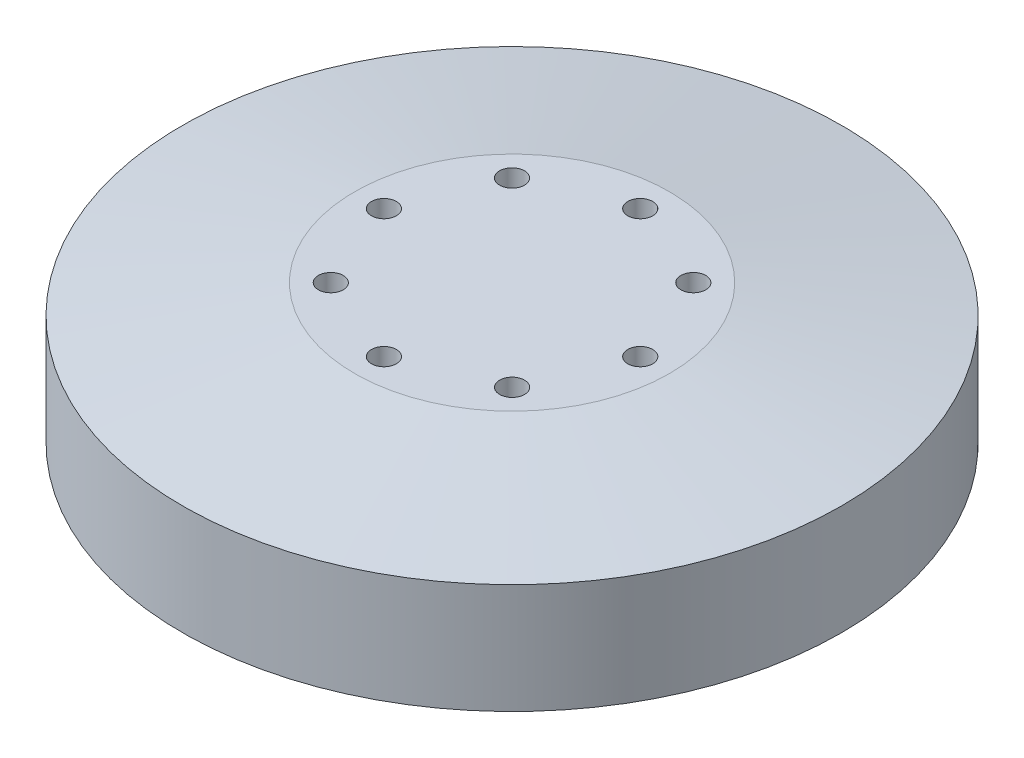
ISO-10303-21;
HEADER;
FILE_DESCRIPTION(('STEP AP214'),'2;1');
FILE_NAME('part.step','',(''),(''),'','','');
FILE_SCHEMA(('AUTOMOTIVE_DESIGN { 1 0 10303 214 1 1 1 1 }'));
ENDSEC;
DATA;
#1=APPLICATION_CONTEXT('core data for automotive mechanical design processes');
#2=APPLICATION_PROTOCOL_DEFINITION('international standard','automotive_design',2000,#1);
#3=PRODUCT_CONTEXT('',#1,'mechanical');
#4=PRODUCT('Part','Part','',(#3));
#5=PRODUCT_RELATED_PRODUCT_CATEGORY('part','',(#4));
#6=PRODUCT_DEFINITION_FORMATION('','',#4);
#7=PRODUCT_DEFINITION_CONTEXT('part definition',#1,'design');
#8=PRODUCT_DEFINITION('design','',#6,#7);
#9=PRODUCT_DEFINITION_SHAPE('','',#8);
#10=(LENGTH_UNIT() NAMED_UNIT(*) SI_UNIT(.MILLI.,.METRE.));
#11=(NAMED_UNIT(*) PLANE_ANGLE_UNIT() SI_UNIT($,.RADIAN.));
#12=(NAMED_UNIT(*) SI_UNIT($,.STERADIAN.) SOLID_ANGLE_UNIT());
#13=UNCERTAINTY_MEASURE_WITH_UNIT(LENGTH_MEASURE(1.E-05),#10,'distance_accuracy_value','');
#14=(GEOMETRIC_REPRESENTATION_CONTEXT(3) GLOBAL_UNCERTAINTY_ASSIGNED_CONTEXT((#13)) GLOBAL_UNIT_ASSIGNED_CONTEXT((#10,
#11,#12)) REPRESENTATION_CONTEXT('',''));
#15=CARTESIAN_POINT('',(0.,0.,0.));
#16=DIRECTION('',(0.,0.,1.));
#17=DIRECTION('',(1.,0.,0.));
#18=AXIS2_PLACEMENT_3D('',#15,#16,#17);
#19=CARTESIAN_POINT('',(0.,-9.45,0.));
#20=DIRECTION('',(0.,-1.,0.));
#21=DIRECTION('',(1.,0.,0.));
#22=AXIS2_PLACEMENT_3D('',#19,#20,#21);
#23=CYLINDRICAL_SURFACE('',#22,45.);
#24=CARTESIAN_POINT('',(0.,-9.44999999999999,0.));
#25=DIRECTION('',(0.,-1.,0.));
#26=DIRECTION('',(1.,0.,0.));
#27=AXIS2_PLACEMENT_3D('',#24,#25,#26);
#28=CIRCLE('',#27,45.);
#29=CARTESIAN_POINT('',(45.,-9.44999999999998,0.));
#30=VERTEX_POINT('',#29);
#31=EDGE_CURVE('E11',#30,#30,#28,.T.);
#32=ORIENTED_EDGE('',*,*,#31,.F.);
#33=EDGE_LOOP('',(#32));
#34=FACE_BOUND('',#33,.T.);
#35=CARTESIAN_POINT('',(0.,5.55,0.));
#36=DIRECTION('',(0.,-1.,0.));
#37=DIRECTION('',(1.,0.,0.));
#38=AXIS2_PLACEMENT_3D('',#35,#36,#37);
#39=CIRCLE('',#38,45.);
#40=CARTESIAN_POINT('',(45.,5.55000000000001,0.));
#41=VERTEX_POINT('',#40);
#42=EDGE_CURVE('E126',#41,#41,#39,.T.);
#43=ORIENTED_EDGE('',*,*,#42,.T.);
#44=EDGE_LOOP('',(#43));
#45=FACE_BOUND('',#44,.T.);
#46=ADVANCED_FACE('F33',(#34,#45),#23,.T.);
#47=CARTESIAN_POINT('',(-45.,-9.45,0.));
#48=DIRECTION('',(0.,1.,0.));
#49=DIRECTION('',(-1.,0.,0.));
#50=AXIS2_PLACEMENT_3D('',#47,#48,#49);
#51=PLANE('',#50);
#52=CARTESIAN_POINT('',(0.,-9.45,0.));
#53=DIRECTION('',(0.,-1.,0.));
#54=DIRECTION('',(1.,0.,0.));
#55=AXIS2_PLACEMENT_3D('',#52,#53,#54);
#56=CIRCLE('',#55,43.);
#57=CARTESIAN_POINT('',(43.,-9.44999999999999,0.));
#58=VERTEX_POINT('',#57);
#59=EDGE_CURVE('E122',#58,#58,#56,.T.);
#60=ORIENTED_EDGE('',*,*,#59,.F.);
#61=EDGE_LOOP('',(#60));
#62=FACE_BOUND('',#61,.T.);
#63=ORIENTED_EDGE('',*,*,#31,.T.);
#64=EDGE_LOOP('',(#63));
#65=FACE_BOUND('',#64,.T.);
#66=ADVANCED_FACE('F137',(#62,#65),#51,.F.);
#67=CARTESIAN_POINT('',(0.,9.45,0.));
#68=DIRECTION('',(0.,-1.,0.));
#69=DIRECTION('',(1.,0.,0.));
#70=AXIS2_PLACEMENT_3D('',#67,#68,#69);
#71=PLANE('',#70);
#72=CARTESIAN_POINT('',(0.,9.45,-17.5));
#73=DIRECTION('',(0.,1.,0.));
#74=DIRECTION('',(0.,0.,1.));
#75=AXIS2_PLACEMENT_3D('',#72,#73,#74);
#76=CIRCLE('',#75,1.69999999999999);
#77=CARTESIAN_POINT('',(0.,9.45,-15.8));
#78=VERTEX_POINT('',#77);
#79=EDGE_CURVE('E76',#78,#78,#76,.T.);
#80=ORIENTED_EDGE('',*,*,#79,.F.);
#81=EDGE_LOOP('',(#80));
#82=FACE_BOUND('',#81,.T.);
#83=CARTESIAN_POINT('',(-12.3743686707646,9.45,-12.3743686707646));
#84=DIRECTION('',(0.,1.,0.));
#85=DIRECTION('',(0.,0.,1.));
#86=AXIS2_PLACEMENT_3D('',#83,#84,#85);
#87=CIRCLE('',#86,1.69999999999999);
#88=CARTESIAN_POINT('',(-12.3743686707646,9.45,-10.6743686707646));
#89=VERTEX_POINT('',#88);
#90=EDGE_CURVE('E75',#89,#89,#87,.T.);
#91=ORIENTED_EDGE('',*,*,#90,.F.);
#92=EDGE_LOOP('',(#91));
#93=FACE_BOUND('',#92,.T.);
#94=CARTESIAN_POINT('',(-17.5,9.44999999999999,0.));
#95=DIRECTION('',(0.,1.,0.));
#96=DIRECTION('',(0.,0.,1.));
#97=AXIS2_PLACEMENT_3D('',#94,#95,#96);
#98=CIRCLE('',#97,1.69999999999999);
#99=CARTESIAN_POINT('',(-17.5,9.44999999999999,1.69999999999999));
#100=VERTEX_POINT('',#99);
#101=EDGE_CURVE('E86',#100,#100,#98,.T.);
#102=ORIENTED_EDGE('',*,*,#101,.F.);
#103=EDGE_LOOP('',(#102));
#104=FACE_BOUND('',#103,.T.);
#105=CARTESIAN_POINT('',(-12.3743686707646,9.45,12.3743686707646));
#106=DIRECTION('',(0.,1.,0.));
#107=DIRECTION('',(0.,0.,1.));
#108=AXIS2_PLACEMENT_3D('',#105,#106,#107);
#109=CIRCLE('',#108,1.69999999999999);
#110=CARTESIAN_POINT('',(-12.3743686707646,9.45,14.0743686707645));
#111=VERTEX_POINT('',#110);
#112=EDGE_CURVE('E92',#111,#111,#109,.T.);
#113=ORIENTED_EDGE('',*,*,#112,.F.);
#114=EDGE_LOOP('',(#113));
#115=FACE_BOUND('',#114,.T.);
#116=CARTESIAN_POINT('',(0.,9.45,17.5));
#117=DIRECTION('',(0.,1.,0.));
#118=DIRECTION('',(0.,0.,1.));
#119=AXIS2_PLACEMENT_3D('',#116,#117,#118);
#120=CIRCLE('',#119,1.69999999999999);
#121=CARTESIAN_POINT('',(0.,9.45,19.2));
#122=VERTEX_POINT('',#121);
#123=EDGE_CURVE('E98',#122,#122,#120,.T.);
#124=ORIENTED_EDGE('',*,*,#123,.F.);
#125=EDGE_LOOP('',(#124));
#126=FACE_BOUND('',#125,.T.);
#127=CARTESIAN_POINT('',(12.3743686707646,9.45,12.3743686707646));
#128=DIRECTION('',(0.,1.,0.));
#129=DIRECTION('',(0.,0.,1.));
#130=AXIS2_PLACEMENT_3D('',#127,#128,#129);
#131=CIRCLE('',#130,1.69999999999999);
#132=CARTESIAN_POINT('',(12.3743686707646,9.45,14.0743686707646));
#133=VERTEX_POINT('',#132);
#134=EDGE_CURVE('E104',#133,#133,#131,.T.);
#135=ORIENTED_EDGE('',*,*,#134,.F.);
#136=EDGE_LOOP('',(#135));
#137=FACE_BOUND('',#136,.T.);
#138=CARTESIAN_POINT('',(17.5,9.45,0.));
#139=DIRECTION('',(0.,1.,0.));
#140=DIRECTION('',(0.,0.,1.));
#141=AXIS2_PLACEMENT_3D('',#138,#139,#140);
#142=CIRCLE('',#141,1.69999999999999);
#143=CARTESIAN_POINT('',(17.5,9.45,1.69999999999999));
#144=VERTEX_POINT('',#143);
#145=EDGE_CURVE('E110',#144,#144,#142,.T.);
#146=ORIENTED_EDGE('',*,*,#145,.F.);
#147=EDGE_LOOP('',(#146));
#148=FACE_BOUND('',#147,.T.);
#149=CARTESIAN_POINT('',(12.3743686707646,9.45,-12.3743686707646));
#150=DIRECTION('',(0.,1.,0.));
#151=DIRECTION('',(0.,0.,1.));
#152=AXIS2_PLACEMENT_3D('',#149,#150,#151);
#153=CIRCLE('',#152,1.69999999999999);
#154=CARTESIAN_POINT('',(12.3743686707646,9.45,-10.6743686707646));
#155=VERTEX_POINT('',#154);
#156=EDGE_CURVE('E116',#155,#155,#153,.T.);
#157=ORIENTED_EDGE('',*,*,#156,.F.);
#158=EDGE_LOOP('',(#157));
#159=FACE_BOUND('',#158,.T.);
#160=CARTESIAN_POINT('',(0.,9.44999999999999,0.));
#161=DIRECTION('',(0.,-1.,0.));
#162=DIRECTION('',(1.,0.,0.));
#163=AXIS2_PLACEMENT_3D('',#160,#161,#162);
#164=CIRCLE('',#163,21.5);
#165=CARTESIAN_POINT('',(21.5,9.44999999999999,0.));
#166=VERTEX_POINT('',#165);
#167=EDGE_CURVE('E40',#166,#166,#164,.T.);
#168=ORIENTED_EDGE('',*,*,#167,.F.);
#169=EDGE_LOOP('',(#168));
#170=FACE_BOUND('',#169,.T.);
#171=ADVANCED_FACE('F135',(#82,#93,#104,#115,#126,#137,#148,#159,#170),#71,.F.);
#172=CARTESIAN_POINT('',(0.,9.44999999999999,0.));
#173=DIRECTION('',(0.,-1.,0.));
#174=DIRECTION('',(1.,0.,0.));
#175=AXIS2_PLACEMENT_3D('',#172,#173,#174);
#176=CONICAL_SURFACE('',#175,21.5,1.40633778039562);
#177=ORIENTED_EDGE('',*,*,#42,.F.);
#178=EDGE_LOOP('',(#177));
#179=FACE_BOUND('',#178,.T.);
#180=ORIENTED_EDGE('',*,*,#167,.T.);
#181=EDGE_LOOP('',(#180));
#182=FACE_BOUND('',#181,.T.);
#183=ADVANCED_FACE('F133',(#179,#182),#176,.T.);
#184=CARTESIAN_POINT('',(0.,-8.45,0.));
#185=DIRECTION('',(0.,-1.,0.));
#186=DIRECTION('',(1.,0.,0.));
#187=AXIS2_PLACEMENT_3D('',#184,#185,#186);
#188=CYLINDRICAL_SURFACE('',#187,43.);
#189=CARTESIAN_POINT('',(0.,-8.45,0.));
#190=DIRECTION('',(0.,-1.,0.));
#191=DIRECTION('',(1.,0.,0.));
#192=AXIS2_PLACEMENT_3D('',#189,#190,#191);
#193=CIRCLE('',#192,43.);
#194=CARTESIAN_POINT('',(43.,-8.44999999999999,0.));
#195=VERTEX_POINT('',#194);
#196=EDGE_CURVE('E123',#195,#195,#193,.T.);
#197=ORIENTED_EDGE('',*,*,#196,.F.);
#198=EDGE_LOOP('',(#197));
#199=FACE_BOUND('',#198,.T.);
#200=ORIENTED_EDGE('',*,*,#59,.T.);
#201=EDGE_LOOP('',(#200));
#202=FACE_BOUND('',#201,.T.);
#203=ADVANCED_FACE('F144',(#199,#202),#188,.F.);
#204=CARTESIAN_POINT('',(0.,-8.45,0.));
#205=DIRECTION('',(0.,-1.,0.));
#206=DIRECTION('',(1.,0.,0.));
#207=AXIS2_PLACEMENT_3D('',#204,#205,#206);
#208=PLANE('',#207);
#209=ORIENTED_EDGE('',*,*,#196,.T.);
#210=EDGE_LOOP('',(#209));
#211=FACE_BOUND('',#210,.T.);
#212=ADVANCED_FACE('F175',(#211),#208,.T.);
#213=CARTESIAN_POINT('',(12.3743686707646,5.45,-12.3743686707646));
#214=DIRECTION('',(0.,1.,0.));
#215=DIRECTION('',(0.,0.,1.));
#216=AXIS2_PLACEMENT_3D('',#213,#214,#215);
#217=CONICAL_SURFACE('',#216,1.7,1.02974425867665);
#218=CARTESIAN_POINT('',(12.3743686707646,4.42853694765314,-12.3743686707646));
#219=VERTEX_POINT('',#218);
#220=VERTEX_LOOP('',#219);
#221=FACE_BOUND('',#220,.T.);
#222=CARTESIAN_POINT('',(12.3743686707646,5.45,-12.3743686707646));
#223=DIRECTION('',(0.,1.,0.));
#224=DIRECTION('',(0.,0.,1.));
#225=AXIS2_PLACEMENT_3D('',#222,#223,#224);
#226=CIRCLE('',#225,1.7);
#227=CARTESIAN_POINT('',(12.3743686707646,5.45,-10.6743686707646));
#228=VERTEX_POINT('',#227);
#229=EDGE_CURVE('E119',#228,#228,#226,.T.);
#230=ORIENTED_EDGE('',*,*,#229,.T.);
#231=EDGE_LOOP('',(#230));
#232=FACE_BOUND('',#231,.T.);
#233=ADVANCED_FACE('F184',(#221,#232),#217,.F.);
#234=CARTESIAN_POINT('',(12.3743686707646,9.45,-12.3743686707646));
#235=DIRECTION('',(0.,1.,0.));
#236=DIRECTION('',(0.,0.,1.));
#237=AXIS2_PLACEMENT_3D('',#234,#235,#236);
#238=CYLINDRICAL_SURFACE('',#237,1.69999999999999);
#239=ORIENTED_EDGE('',*,*,#229,.F.);
#240=EDGE_LOOP('',(#239));
#241=FACE_BOUND('',#240,.T.);
#242=ORIENTED_EDGE('',*,*,#156,.T.);
#243=EDGE_LOOP('',(#242));
#244=FACE_BOUND('',#243,.T.);
#245=ADVANCED_FACE('F198',(#241,#244),#238,.F.);
#246=CARTESIAN_POINT('',(17.5,5.45,0.));
#247=DIRECTION('',(0.,1.,0.));
#248=DIRECTION('',(0.,0.,1.));
#249=AXIS2_PLACEMENT_3D('',#246,#247,#248);
#250=CONICAL_SURFACE('',#249,1.7,1.02974425867665);
#251=CARTESIAN_POINT('',(17.5,4.42853694765314,0.));
#252=VERTEX_POINT('',#251);
#253=VERTEX_LOOP('',#252);
#254=FACE_BOUND('',#253,.T.);
#255=CARTESIAN_POINT('',(17.5,5.45,0.));
#256=DIRECTION('',(0.,1.,0.));
#257=DIRECTION('',(0.,0.,1.));
#258=AXIS2_PLACEMENT_3D('',#255,#256,#257);
#259=CIRCLE('',#258,1.7);
#260=CARTESIAN_POINT('',(17.5,5.45,1.7));
#261=VERTEX_POINT('',#260);
#262=EDGE_CURVE('E113',#261,#261,#259,.T.);
#263=ORIENTED_EDGE('',*,*,#262,.T.);
#264=EDGE_LOOP('',(#263));
#265=FACE_BOUND('',#264,.T.);
#266=ADVANCED_FACE('F207',(#254,#265),#250,.F.);
#267=CARTESIAN_POINT('',(17.5,9.45,0.));
#268=DIRECTION('',(0.,1.,0.));
#269=DIRECTION('',(0.,0.,1.));
#270=AXIS2_PLACEMENT_3D('',#267,#268,#269);
#271=CYLINDRICAL_SURFACE('',#270,1.69999999999999);
#272=ORIENTED_EDGE('',*,*,#262,.F.);
#273=EDGE_LOOP('',(#272));
#274=FACE_BOUND('',#273,.T.);
#275=ORIENTED_EDGE('',*,*,#145,.T.);
#276=EDGE_LOOP('',(#275));
#277=FACE_BOUND('',#276,.T.);
#278=ADVANCED_FACE('F217',(#274,#277),#271,.F.);
#279=CARTESIAN_POINT('',(12.3743686707646,5.45,12.3743686707646));
#280=DIRECTION('',(0.,1.,0.));
#281=DIRECTION('',(0.,0.,1.));
#282=AXIS2_PLACEMENT_3D('',#279,#280,#281);
#283=CONICAL_SURFACE('',#282,1.7,1.02974425867665);
#284=CARTESIAN_POINT('',(12.3743686707646,4.42853694765314,12.3743686707646));
#285=VERTEX_POINT('',#284);
#286=VERTEX_LOOP('',#285);
#287=FACE_BOUND('',#286,.T.);
#288=CARTESIAN_POINT('',(12.3743686707646,5.45,12.3743686707646));
#289=DIRECTION('',(0.,1.,0.));
#290=DIRECTION('',(0.,0.,1.));
#291=AXIS2_PLACEMENT_3D('',#288,#289,#290);
#292=CIRCLE('',#291,1.7);
#293=CARTESIAN_POINT('',(12.3743686707646,5.45,14.0743686707646));
#294=VERTEX_POINT('',#293);
#295=EDGE_CURVE('E107',#294,#294,#292,.T.);
#296=ORIENTED_EDGE('',*,*,#295,.T.);
#297=EDGE_LOOP('',(#296));
#298=FACE_BOUND('',#297,.T.);
#299=ADVANCED_FACE('F226',(#287,#298),#283,.F.);
#300=CARTESIAN_POINT('',(12.3743686707646,9.45,12.3743686707646));
#301=DIRECTION('',(0.,1.,0.));
#302=DIRECTION('',(0.,0.,1.));
#303=AXIS2_PLACEMENT_3D('',#300,#301,#302);
#304=CYLINDRICAL_SURFACE('',#303,1.69999999999999);
#305=ORIENTED_EDGE('',*,*,#295,.F.);
#306=EDGE_LOOP('',(#305));
#307=FACE_BOUND('',#306,.T.);
#308=ORIENTED_EDGE('',*,*,#134,.T.);
#309=EDGE_LOOP('',(#308));
#310=FACE_BOUND('',#309,.T.);
#311=ADVANCED_FACE('F236',(#307,#310),#304,.F.);
#312=CARTESIAN_POINT('',(0.,5.44999999999999,17.5));
#313=DIRECTION('',(0.,1.,0.));
#314=DIRECTION('',(0.,0.,1.));
#315=AXIS2_PLACEMENT_3D('',#312,#313,#314);
#316=CONICAL_SURFACE('',#315,1.7,1.02974425867665);
#317=CARTESIAN_POINT('',(0.,4.42853694765314,17.5));
#318=VERTEX_POINT('',#317);
#319=VERTEX_LOOP('',#318);
#320=FACE_BOUND('',#319,.T.);
#321=CARTESIAN_POINT('',(0.,5.44999999999999,17.5));
#322=DIRECTION('',(0.,1.,0.));
#323=DIRECTION('',(0.,0.,1.));
#324=AXIS2_PLACEMENT_3D('',#321,#322,#323);
#325=CIRCLE('',#324,1.7);
#326=CARTESIAN_POINT('',(0.,5.44999999999999,19.2));
#327=VERTEX_POINT('',#326);
#328=EDGE_CURVE('E101',#327,#327,#325,.T.);
#329=ORIENTED_EDGE('',*,*,#328,.T.);
#330=EDGE_LOOP('',(#329));
#331=FACE_BOUND('',#330,.T.);
#332=ADVANCED_FACE('F246',(#320,#331),#316,.F.);
#333=CARTESIAN_POINT('',(0.,9.45,17.5));
#334=DIRECTION('',(0.,1.,0.));
#335=DIRECTION('',(0.,0.,1.));
#336=AXIS2_PLACEMENT_3D('',#333,#334,#335);
#337=CYLINDRICAL_SURFACE('',#336,1.69999999999999);
#338=ORIENTED_EDGE('',*,*,#328,.F.);
#339=EDGE_LOOP('',(#338));
#340=FACE_BOUND('',#339,.T.);
#341=ORIENTED_EDGE('',*,*,#123,.T.);
#342=EDGE_LOOP('',(#341));
#343=FACE_BOUND('',#342,.T.);
#344=ADVANCED_FACE('F256',(#340,#343),#337,.F.);
#345=CARTESIAN_POINT('',(-12.3743686707646,5.44999999999999,12.3743686707646));
#346=DIRECTION('',(0.,1.,0.));
#347=DIRECTION('',(0.,0.,1.));
#348=AXIS2_PLACEMENT_3D('',#345,#346,#347);
#349=CONICAL_SURFACE('',#348,1.7,1.02974425867665);
#350=CARTESIAN_POINT('',(-12.3743686707646,4.42853694765314,12.3743686707646));
#351=VERTEX_POINT('',#350);
#352=VERTEX_LOOP('',#351);
#353=FACE_BOUND('',#352,.T.);
#354=CARTESIAN_POINT('',(-12.3743686707646,5.44999999999999,12.3743686707646));
#355=DIRECTION('',(0.,1.,0.));
#356=DIRECTION('',(0.,0.,1.));
#357=AXIS2_PLACEMENT_3D('',#354,#355,#356);
#358=CIRCLE('',#357,1.7);
#359=CARTESIAN_POINT('',(-12.3743686707646,5.44999999999999,14.0743686707646));
#360=VERTEX_POINT('',#359);
#361=EDGE_CURVE('E95',#360,#360,#358,.T.);
#362=ORIENTED_EDGE('',*,*,#361,.T.);
#363=EDGE_LOOP('',(#362));
#364=FACE_BOUND('',#363,.T.);
#365=ADVANCED_FACE('F266',(#353,#364),#349,.F.);
#366=CARTESIAN_POINT('',(-12.3743686707646,9.44999999999999,12.3743686707646));
#367=DIRECTION('',(0.,1.,0.));
#368=DIRECTION('',(0.,0.,1.));
#369=AXIS2_PLACEMENT_3D('',#366,#367,#368);
#370=CYLINDRICAL_SURFACE('',#369,1.69999999999999);
#371=ORIENTED_EDGE('',*,*,#361,.F.);
#372=EDGE_LOOP('',(#371));
#373=FACE_BOUND('',#372,.T.);
#374=ORIENTED_EDGE('',*,*,#112,.T.);
#375=EDGE_LOOP('',(#374));
#376=FACE_BOUND('',#375,.T.);
#377=ADVANCED_FACE('F276',(#373,#376),#370,.F.);
#378=CARTESIAN_POINT('',(-17.5,5.44999999999999,0.));
#379=DIRECTION('',(0.,1.,0.));
#380=DIRECTION('',(0.,0.,1.));
#381=AXIS2_PLACEMENT_3D('',#378,#379,#380);
#382=CONICAL_SURFACE('',#381,1.7,1.02974425867665);
#383=CARTESIAN_POINT('',(-17.5,4.42853694765314,0.));
#384=VERTEX_POINT('',#383);
#385=VERTEX_LOOP('',#384);
#386=FACE_BOUND('',#385,.T.);
#387=CARTESIAN_POINT('',(-17.5,5.44999999999999,0.));
#388=DIRECTION('',(0.,1.,0.));
#389=DIRECTION('',(0.,0.,1.));
#390=AXIS2_PLACEMENT_3D('',#387,#388,#389);
#391=CIRCLE('',#390,1.7);
#392=CARTESIAN_POINT('',(-17.5,5.44999999999999,1.7));
#393=VERTEX_POINT('',#392);
#394=EDGE_CURVE('E89',#393,#393,#391,.T.);
#395=ORIENTED_EDGE('',*,*,#394,.T.);
#396=EDGE_LOOP('',(#395));
#397=FACE_BOUND('',#396,.T.);
#398=ADVANCED_FACE('F286',(#386,#397),#382,.F.);
#399=CARTESIAN_POINT('',(-17.5,9.44999999999999,0.));
#400=DIRECTION('',(0.,1.,0.));
#401=DIRECTION('',(0.,0.,1.));
#402=AXIS2_PLACEMENT_3D('',#399,#400,#401);
#403=CYLINDRICAL_SURFACE('',#402,1.69999999999999);
#404=ORIENTED_EDGE('',*,*,#394,.F.);
#405=EDGE_LOOP('',(#404));
#406=FACE_BOUND('',#405,.T.);
#407=ORIENTED_EDGE('',*,*,#101,.T.);
#408=EDGE_LOOP('',(#407));
#409=FACE_BOUND('',#408,.T.);
#410=ADVANCED_FACE('F296',(#406,#409),#403,.F.);
#411=CARTESIAN_POINT('',(-12.3743686707646,5.44999999999999,-12.3743686707646));
#412=DIRECTION('',(0.,1.,0.));
#413=DIRECTION('',(0.,0.,1.));
#414=AXIS2_PLACEMENT_3D('',#411,#412,#413);
#415=CONICAL_SURFACE('',#414,1.7,1.02974425867665);
#416=CARTESIAN_POINT('',(-12.3743686707646,4.42853694765314,-12.3743686707646));
#417=VERTEX_POINT('',#416);
#418=VERTEX_LOOP('',#417);
#419=FACE_BOUND('',#418,.T.);
#420=CARTESIAN_POINT('',(-12.3743686707646,5.44999999999999,-12.3743686707646));
#421=DIRECTION('',(0.,1.,0.));
#422=DIRECTION('',(0.,0.,1.));
#423=AXIS2_PLACEMENT_3D('',#420,#421,#422);
#424=CIRCLE('',#423,1.7);
#425=CARTESIAN_POINT('',(-12.3743686707646,5.44999999999999,-10.6743686707646));
#426=VERTEX_POINT('',#425);
#427=EDGE_CURVE('E79',#426,#426,#424,.T.);
#428=ORIENTED_EDGE('',*,*,#427,.T.);
#429=EDGE_LOOP('',(#428));
#430=FACE_BOUND('',#429,.T.);
#431=ADVANCED_FACE('F306',(#419,#430),#415,.F.);
#432=CARTESIAN_POINT('',(-12.3743686707646,9.44999999999999,-12.3743686707646));
#433=DIRECTION('',(0.,1.,0.));
#434=DIRECTION('',(0.,0.,1.));
#435=AXIS2_PLACEMENT_3D('',#432,#433,#434);
#436=CYLINDRICAL_SURFACE('',#435,1.69999999999999);
#437=ORIENTED_EDGE('',*,*,#427,.F.);
#438=EDGE_LOOP('',(#437));
#439=FACE_BOUND('',#438,.T.);
#440=ORIENTED_EDGE('',*,*,#90,.T.);
#441=EDGE_LOOP('',(#440));
#442=FACE_BOUND('',#441,.T.);
#443=ADVANCED_FACE('F69',(#439,#442),#436,.F.);
#444=CARTESIAN_POINT('',(0.,5.44999999999999,-17.5));
#445=DIRECTION('',(0.,1.,0.));
#446=DIRECTION('',(0.,0.,1.));
#447=AXIS2_PLACEMENT_3D('',#444,#445,#446);
#448=CONICAL_SURFACE('',#447,1.7,1.02974425867665);
#449=CARTESIAN_POINT('',(0.,4.42853694765314,-17.5));
#450=VERTEX_POINT('',#449);
#451=VERTEX_LOOP('',#450);
#452=FACE_BOUND('',#451,.T.);
#453=CARTESIAN_POINT('',(0.,5.44999999999999,-17.5));
#454=DIRECTION('',(0.,1.,0.));
#455=DIRECTION('',(0.,0.,1.));
#456=AXIS2_PLACEMENT_3D('',#453,#454,#455);
#457=CIRCLE('',#456,1.7);
#458=CARTESIAN_POINT('',(0.,5.44999999999999,-15.8));
#459=VERTEX_POINT('',#458);
#460=EDGE_CURVE('E73',#459,#459,#457,.T.);
#461=ORIENTED_EDGE('',*,*,#460,.T.);
#462=EDGE_LOOP('',(#461));
#463=FACE_BOUND('',#462,.T.);
#464=ADVANCED_FACE('F65',(#452,#463),#448,.F.);
#465=CARTESIAN_POINT('',(0.,9.45,-17.5));
#466=DIRECTION('',(0.,1.,0.));
#467=DIRECTION('',(0.,0.,1.));
#468=AXIS2_PLACEMENT_3D('',#465,#466,#467);
#469=CYLINDRICAL_SURFACE('',#468,1.69999999999999);
#470=ORIENTED_EDGE('',*,*,#460,.F.);
#471=EDGE_LOOP('',(#470));
#472=FACE_BOUND('',#471,.T.);
#473=ORIENTED_EDGE('',*,*,#79,.T.);
#474=EDGE_LOOP('',(#473));
#475=FACE_BOUND('',#474,.T.);
#476=ADVANCED_FACE('F68',(#472,#475),#469,.F.);
#477=CLOSED_SHELL('',(#46,#66,#171,#183,#203,#212,#233,#245,#266,#278,#299,#311,#332,#344,#365,
#377,#398,#410,#431,#443,#464,#476));
#478=MANIFOLD_SOLID_BREP('B2',#477);
#479=ADVANCED_BREP_SHAPE_REPRESENTATION('',(#18,#478),#14);
#480=SHAPE_DEFINITION_REPRESENTATION(#9,#479);
ENDSEC;
END-ISO-10303-21;
